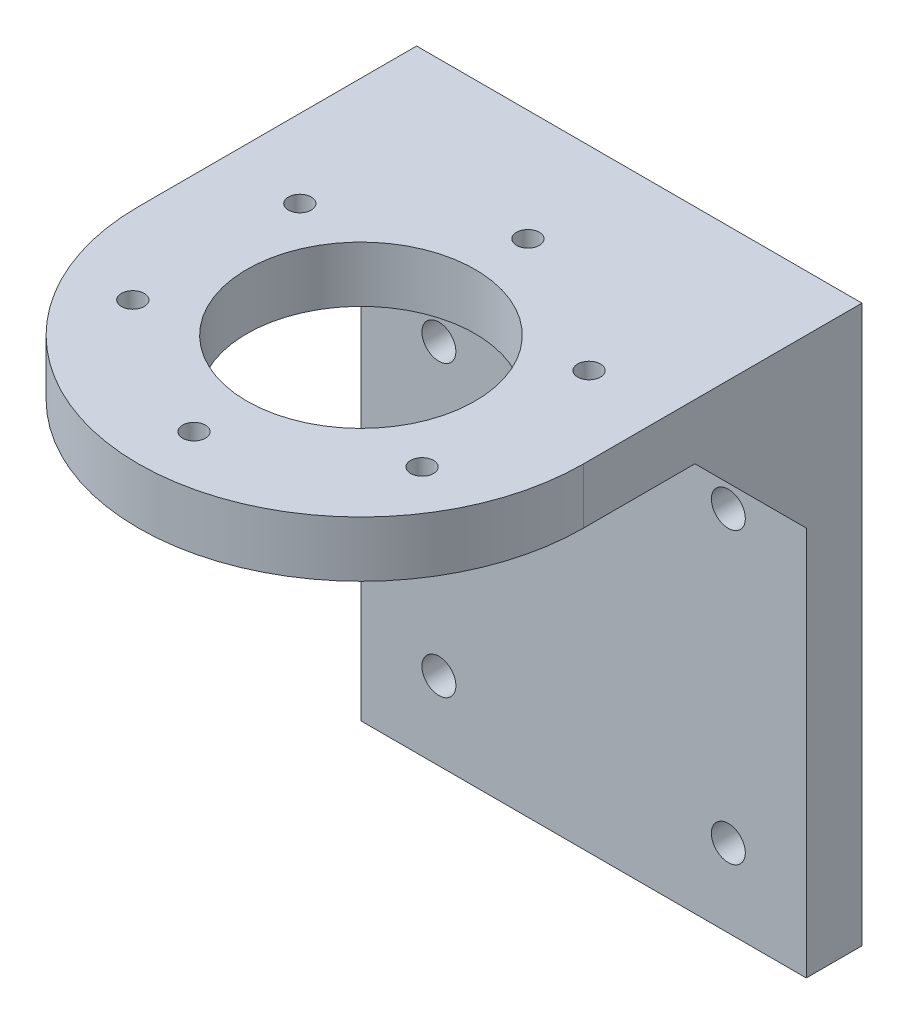
ISO-10303-21;
HEADER;
FILE_DESCRIPTION(('STEP AP214'),'2;1');
FILE_NAME('part.step','',(''),(''),'','','');
FILE_SCHEMA(('AUTOMOTIVE_DESIGN { 1 0 10303 214 1 1 1 1 }'));
ENDSEC;
DATA;
#1=APPLICATION_CONTEXT('core data for automotive mechanical design processes');
#2=APPLICATION_PROTOCOL_DEFINITION('international standard','automotive_design',2000,#1);
#3=PRODUCT_CONTEXT('',#1,'mechanical');
#4=PRODUCT('Part','Part','',(#3));
#5=PRODUCT_RELATED_PRODUCT_CATEGORY('part','',(#4));
#6=PRODUCT_DEFINITION_FORMATION('','',#4);
#7=PRODUCT_DEFINITION_CONTEXT('part definition',#1,'design');
#8=PRODUCT_DEFINITION('design','',#6,#7);
#9=PRODUCT_DEFINITION_SHAPE('','',#8);
#10=(LENGTH_UNIT() NAMED_UNIT(*) SI_UNIT(.MILLI.,.METRE.));
#11=(NAMED_UNIT(*) PLANE_ANGLE_UNIT() SI_UNIT($,.RADIAN.));
#12=(NAMED_UNIT(*) SI_UNIT($,.STERADIAN.) SOLID_ANGLE_UNIT());
#13=UNCERTAINTY_MEASURE_WITH_UNIT(LENGTH_MEASURE(1.E-05),#10,'distance_accuracy_value','');
#14=(GEOMETRIC_REPRESENTATION_CONTEXT(3) GLOBAL_UNCERTAINTY_ASSIGNED_CONTEXT((#13)) GLOBAL_UNIT_ASSIGNED_CONTEXT((#10,
#11,#12)) REPRESENTATION_CONTEXT('',''));
#15=CARTESIAN_POINT('',(0.,0.,0.));
#16=DIRECTION('',(0.,0.,1.));
#17=DIRECTION('',(1.,0.,0.));
#18=AXIS2_PLACEMENT_3D('',#15,#16,#17);
#19=CARTESIAN_POINT('',(20.,5.,-20.));
#20=DIRECTION('',(0.,-1.,0.));
#21=DIRECTION('',(0.,0.,-1.));
#22=AXIS2_PLACEMENT_3D('',#19,#20,#21);
#23=CYLINDRICAL_SURFACE('',#22,20.);
#24=CARTESIAN_POINT('',(20.,0.,-20.));
#25=DIRECTION('',(0.,1.,0.));
#26=DIRECTION('',(0.,0.,1.));
#27=AXIS2_PLACEMENT_3D('',#24,#25,#26);
#28=CIRCLE('',#27,20.);
#29=CARTESIAN_POINT('',(40.,0.,-20.));
#30=VERTEX_POINT('',#29);
#31=CARTESIAN_POINT('',(0.,0.,-20.));
#32=VERTEX_POINT('',#31);
#33=EDGE_CURVE('E231',#30,#32,#28,.F.);
#34=ORIENTED_EDGE('',*,*,#33,.F.);
#35=DIRECTION('',(0.,-1.,0.));
#36=VECTOR('',#35,1.);
#37=CARTESIAN_POINT('',(40.,5.,-20.));
#38=LINE('',#37,#36);
#39=CARTESIAN_POINT('',(40.,5.,-20.));
#40=VERTEX_POINT('',#39);
#41=EDGE_CURVE('E11',#40,#30,#38,.T.);
#42=ORIENTED_EDGE('',*,*,#41,.F.);
#43=CARTESIAN_POINT('',(20.,5.,-20.));
#44=DIRECTION('',(0.,1.,0.));
#45=DIRECTION('',(0.,0.,1.));
#46=AXIS2_PLACEMENT_3D('',#43,#44,#45);
#47=CIRCLE('',#46,20.);
#48=CARTESIAN_POINT('',(0.,5.,-20.));
#49=VERTEX_POINT('',#48);
#50=EDGE_CURVE('E204',#40,#49,#47,.F.);
#51=ORIENTED_EDGE('',*,*,#50,.T.);
#52=DIRECTION('',(0.,-1.,0.));
#53=VECTOR('',#52,1.);
#54=CARTESIAN_POINT('',(0.,5.,-20.));
#55=LINE('',#54,#53);
#56=EDGE_CURVE('E44',#49,#32,#55,.T.);
#57=ORIENTED_EDGE('',*,*,#56,.T.);
#58=EDGE_LOOP('',(#34,#42,#51,#57));
#59=FACE_BOUND('',#58,.T.);
#60=ADVANCED_FACE('F36',(#59),#23,.T.);
#61=CARTESIAN_POINT('',(40.,5.,0.));
#62=DIRECTION('',(-1.,0.,0.));
#63=DIRECTION('',(0.,0.,1.));
#64=AXIS2_PLACEMENT_3D('',#61,#62,#63);
#65=PLANE('',#64);
#66=DIRECTION('',(0.,0.,-1.));
#67=VECTOR('',#66,1.);
#68=CARTESIAN_POINT('',(40.,0.,0.));
#69=LINE('',#68,#67);
#70=CARTESIAN_POINT('',(40.,0.,-30.));
#71=VERTEX_POINT('',#70);
#72=EDGE_CURVE('E233',#30,#71,#69,.T.);
#73=ORIENTED_EDGE('',*,*,#72,.T.);
#74=DIRECTION('',(0.,-0.707106781186547,-0.707106781186548));
#75=VECTOR('',#74,1.);
#76=CARTESIAN_POINT('',(40.,0.,-30.));
#77=LINE('',#76,#75);
#78=CARTESIAN_POINT('',(40.,-10.,-40.));
#79=VERTEX_POINT('',#78);
#80=EDGE_CURVE('E256',#71,#79,#77,.T.);
#81=ORIENTED_EDGE('',*,*,#80,.T.);
#82=DIRECTION('',(0.,1.,0.));
#83=VECTOR('',#82,1.);
#84=CARTESIAN_POINT('',(40.,-45.,-40.));
#85=LINE('',#84,#83);
#86=CARTESIAN_POINT('',(40.,-45.,-40.));
#87=VERTEX_POINT('',#86);
#88=EDGE_CURVE('E187',#87,#79,#85,.T.);
#89=ORIENTED_EDGE('',*,*,#88,.F.);
#90=DIRECTION('',(0.,0.,-1.));
#91=VECTOR('',#90,1.);
#92=CARTESIAN_POINT('',(40.,-45.,-40.));
#93=LINE('',#92,#91);
#94=CARTESIAN_POINT('',(40.,-45.,-45.));
#95=VERTEX_POINT('',#94);
#96=EDGE_CURVE('E171',#87,#95,#93,.T.);
#97=ORIENTED_EDGE('',*,*,#96,.T.);
#98=DIRECTION('',(0.,1.,0.));
#99=VECTOR('',#98,1.);
#100=CARTESIAN_POINT('',(40.,-45.,-45.));
#101=LINE('',#100,#99);
#102=CARTESIAN_POINT('',(40.,5.,-45.));
#103=VERTEX_POINT('',#102);
#104=EDGE_CURVE('E184',#95,#103,#101,.T.);
#105=ORIENTED_EDGE('',*,*,#104,.T.);
#106=DIRECTION('',(0.,0.,-1.));
#107=VECTOR('',#106,1.);
#108=CARTESIAN_POINT('',(40.,5.,0.));
#109=LINE('',#108,#107);
#110=EDGE_CURVE('E207',#40,#103,#109,.T.);
#111=ORIENTED_EDGE('',*,*,#110,.F.);
#112=ORIENTED_EDGE('',*,*,#41,.T.);
#113=EDGE_LOOP('',(#73,#81,#89,#97,#105,#111,#112));
#114=FACE_BOUND('',#113,.T.);
#115=ADVANCED_FACE('F277',(#114),#65,.F.);
#116=CARTESIAN_POINT('',(32.9903810567666,5.,-12.5));
#117=DIRECTION('',(0.,-1.,0.));
#118=DIRECTION('',(0.,0.,-1.));
#119=AXIS2_PLACEMENT_3D('',#116,#117,#118);
#120=CYLINDRICAL_SURFACE('',#119,1.025);
#121=CARTESIAN_POINT('',(32.9903810567666,5.,-12.5));
#122=DIRECTION('',(0.,1.,0.));
#123=DIRECTION('',(0.,0.,1.));
#124=AXIS2_PLACEMENT_3D('',#121,#122,#123);
#125=CIRCLE('',#124,1.025);
#126=CARTESIAN_POINT('',(32.9903810567666,5.,-11.475));
#127=VERTEX_POINT('',#126);
#128=EDGE_CURVE('E214',#127,#127,#125,.F.);
#129=ORIENTED_EDGE('',*,*,#128,.F.);
#130=EDGE_LOOP('',(#129));
#131=FACE_BOUND('',#130,.T.);
#132=CARTESIAN_POINT('',(32.9903810567666,0.,-12.5));
#133=DIRECTION('',(0.,1.,0.));
#134=DIRECTION('',(0.,0.,1.));
#135=AXIS2_PLACEMENT_3D('',#132,#133,#134);
#136=CIRCLE('',#135,1.025);
#137=CARTESIAN_POINT('',(32.9903810567666,0.,-11.475));
#138=VERTEX_POINT('',#137);
#139=EDGE_CURVE('E241',#138,#138,#136,.F.);
#140=ORIENTED_EDGE('',*,*,#139,.T.);
#141=EDGE_LOOP('',(#140));
#142=FACE_BOUND('',#141,.T.);
#143=ADVANCED_FACE('F318',(#131,#142),#120,.F.);
#144=CARTESIAN_POINT('',(20.,5.,-20.));
#145=DIRECTION('',(0.,-1.,0.));
#146=DIRECTION('',(0.,0.,-1.));
#147=AXIS2_PLACEMENT_3D('',#144,#145,#146);
#148=CYLINDRICAL_SURFACE('',#147,10.25);
#149=CARTESIAN_POINT('',(20.,5.,-20.));
#150=DIRECTION('',(0.,1.,0.));
#151=DIRECTION('',(0.,0.,1.));
#152=AXIS2_PLACEMENT_3D('',#149,#150,#151);
#153=CIRCLE('',#152,10.25);
#154=CARTESIAN_POINT('',(20.,5.,-9.75000000000001));
#155=VERTEX_POINT('',#154);
#156=EDGE_CURVE('E211',#155,#155,#153,.T.);
#157=ORIENTED_EDGE('',*,*,#156,.T.);
#158=EDGE_LOOP('',(#157));
#159=FACE_BOUND('',#158,.T.);
#160=CARTESIAN_POINT('',(20.,0.,-20.));
#161=DIRECTION('',(0.,1.,0.));
#162=DIRECTION('',(0.,0.,1.));
#163=AXIS2_PLACEMENT_3D('',#160,#161,#162);
#164=CIRCLE('',#163,10.25);
#165=CARTESIAN_POINT('',(20.,0.,-9.75000000000001));
#166=VERTEX_POINT('',#165);
#167=EDGE_CURVE('E238',#166,#166,#164,.T.);
#168=ORIENTED_EDGE('',*,*,#167,.F.);
#169=EDGE_LOOP('',(#168));
#170=FACE_BOUND('',#169,.T.);
#171=ADVANCED_FACE('F432',(#159,#170),#148,.F.);
#172=CARTESIAN_POINT('',(0.,5.,0.));
#173=DIRECTION('',(-1.,0.,0.));
#174=DIRECTION('',(0.,0.,1.));
#175=AXIS2_PLACEMENT_3D('',#172,#173,#174);
#176=PLANE('',#175);
#177=DIRECTION('',(0.,0.,-1.));
#178=VECTOR('',#177,1.);
#179=CARTESIAN_POINT('',(0.,0.,0.));
#180=LINE('',#179,#178);
#181=CARTESIAN_POINT('',(0.,0.,-30.));
#182=VERTEX_POINT('',#181);
#183=EDGE_CURVE('E134',#32,#182,#180,.T.);
#184=ORIENTED_EDGE('',*,*,#183,.F.);
#185=ORIENTED_EDGE('',*,*,#56,.F.);
#186=DIRECTION('',(0.,0.,-1.));
#187=VECTOR('',#186,1.);
#188=CARTESIAN_POINT('',(0.,5.,0.));
#189=LINE('',#188,#187);
#190=CARTESIAN_POINT('',(0.,5.,-45.));
#191=VERTEX_POINT('',#190);
#192=EDGE_CURVE('E209',#49,#191,#189,.T.);
#193=ORIENTED_EDGE('',*,*,#192,.T.);
#194=DIRECTION('',(0.,1.,0.));
#195=VECTOR('',#194,1.);
#196=CARTESIAN_POINT('',(0.,-45.,-45.));
#197=LINE('',#196,#195);
#198=CARTESIAN_POINT('',(0.,-45.,-45.));
#199=VERTEX_POINT('',#198);
#200=EDGE_CURVE('E180',#199,#191,#197,.T.);
#201=ORIENTED_EDGE('',*,*,#200,.F.);
#202=DIRECTION('',(0.,0.,1.));
#203=VECTOR('',#202,1.);
#204=CARTESIAN_POINT('',(0.,-45.,-40.));
#205=LINE('',#204,#203);
#206=CARTESIAN_POINT('',(0.,-45.,-40.));
#207=VERTEX_POINT('',#206);
#208=EDGE_CURVE('E165',#199,#207,#205,.T.);
#209=ORIENTED_EDGE('',*,*,#208,.T.);
#210=DIRECTION('',(0.,1.,0.));
#211=VECTOR('',#210,1.);
#212=CARTESIAN_POINT('',(0.,-45.,-40.));
#213=LINE('',#212,#211);
#214=CARTESIAN_POINT('',(0.,-10.,-40.));
#215=VERTEX_POINT('',#214);
#216=EDGE_CURVE('E177',#207,#215,#213,.T.);
#217=ORIENTED_EDGE('',*,*,#216,.T.);
#218=DIRECTION('',(0.,0.707106781186547,0.707106781186548));
#219=VECTOR('',#218,1.);
#220=CARTESIAN_POINT('',(0.,-10.,-40.));
#221=LINE('',#220,#219);
#222=EDGE_CURVE('E127',#215,#182,#221,.T.);
#223=ORIENTED_EDGE('',*,*,#222,.T.);
#224=EDGE_LOOP('',(#184,#185,#193,#201,#209,#217,#223));
#225=FACE_BOUND('',#224,.T.);
#226=ADVANCED_FACE('F250',(#225),#176,.T.);
#227=CARTESIAN_POINT('',(20.,5.,-5.00000000000001));
#228=DIRECTION('',(0.,-1.,0.));
#229=DIRECTION('',(0.,0.,-1.));
#230=AXIS2_PLACEMENT_3D('',#227,#228,#229);
#231=CYLINDRICAL_SURFACE('',#230,1.025);
#232=CARTESIAN_POINT('',(20.,5.,-5.00000000000001));
#233=DIRECTION('',(0.,1.,0.));
#234=DIRECTION('',(0.,0.,1.));
#235=AXIS2_PLACEMENT_3D('',#232,#233,#234);
#236=CIRCLE('',#235,1.025);
#237=CARTESIAN_POINT('',(20.,5.,-3.97500000000001));
#238=VERTEX_POINT('',#237);
#239=EDGE_CURVE('E201',#238,#238,#236,.T.);
#240=ORIENTED_EDGE('',*,*,#239,.T.);
#241=EDGE_LOOP('',(#240));
#242=FACE_BOUND('',#241,.T.);
#243=CARTESIAN_POINT('',(20.,0.,-5.00000000000001));
#244=DIRECTION('',(0.,1.,0.));
#245=DIRECTION('',(0.,0.,1.));
#246=AXIS2_PLACEMENT_3D('',#243,#244,#245);
#247=CIRCLE('',#246,1.025);
#248=CARTESIAN_POINT('',(20.,0.,-3.97500000000001));
#249=VERTEX_POINT('',#248);
#250=EDGE_CURVE('E228',#249,#249,#247,.T.);
#251=ORIENTED_EDGE('',*,*,#250,.F.);
#252=EDGE_LOOP('',(#251));
#253=FACE_BOUND('',#252,.T.);
#254=ADVANCED_FACE('F322',(#242,#253),#231,.F.);
#255=CARTESIAN_POINT('',(32.9903810567666,5.,-27.5));
#256=DIRECTION('',(0.,-1.,0.));
#257=DIRECTION('',(0.,0.,-1.));
#258=AXIS2_PLACEMENT_3D('',#255,#256,#257);
#259=CYLINDRICAL_SURFACE('',#258,1.025);
#260=CARTESIAN_POINT('',(32.9903810567666,5.,-27.5));
#261=DIRECTION('',(0.,1.,0.));
#262=DIRECTION('',(0.,0.,1.));
#263=AXIS2_PLACEMENT_3D('',#260,#261,#262);
#264=CIRCLE('',#263,1.025);
#265=CARTESIAN_POINT('',(32.9903810567666,5.,-26.475));
#266=VERTEX_POINT('',#265);
#267=EDGE_CURVE('E198',#266,#266,#264,.T.);
#268=ORIENTED_EDGE('',*,*,#267,.T.);
#269=EDGE_LOOP('',(#268));
#270=FACE_BOUND('',#269,.T.);
#271=CARTESIAN_POINT('',(32.9903810567666,0.,-27.5));
#272=DIRECTION('',(0.,1.,0.));
#273=DIRECTION('',(0.,0.,1.));
#274=AXIS2_PLACEMENT_3D('',#271,#272,#273);
#275=CIRCLE('',#274,1.025);
#276=CARTESIAN_POINT('',(32.9903810567666,0.,-26.475));
#277=VERTEX_POINT('',#276);
#278=EDGE_CURVE('E225',#277,#277,#275,.T.);
#279=ORIENTED_EDGE('',*,*,#278,.F.);
#280=EDGE_LOOP('',(#279));
#281=FACE_BOUND('',#280,.T.);
#282=ADVANCED_FACE('F325',(#270,#281),#259,.F.);
#283=CARTESIAN_POINT('',(7.00961894323342,5.,-27.5));
#284=DIRECTION('',(0.,-1.,0.));
#285=DIRECTION('',(0.,0.,-1.));
#286=AXIS2_PLACEMENT_3D('',#283,#284,#285);
#287=CYLINDRICAL_SURFACE('',#286,1.02499999999999);
#288=CARTESIAN_POINT('',(7.00961894323342,5.,-27.5));
#289=DIRECTION('',(0.,1.,0.));
#290=DIRECTION('',(0.,0.,1.));
#291=AXIS2_PLACEMENT_3D('',#288,#289,#290);
#292=CIRCLE('',#291,1.02499999999999);
#293=CARTESIAN_POINT('',(7.00961894323342,5.,-26.475));
#294=VERTEX_POINT('',#293);
#295=EDGE_CURVE('E194',#294,#294,#292,.T.);
#296=ORIENTED_EDGE('',*,*,#295,.T.);
#297=EDGE_LOOP('',(#296));
#298=FACE_BOUND('',#297,.T.);
#299=CARTESIAN_POINT('',(7.00961894323342,0.,-27.5));
#300=DIRECTION('',(0.,1.,0.));
#301=DIRECTION('',(0.,0.,1.));
#302=AXIS2_PLACEMENT_3D('',#299,#300,#301);
#303=CIRCLE('',#302,1.02499999999999);
#304=CARTESIAN_POINT('',(7.00961894323342,0.,-26.475));
#305=VERTEX_POINT('',#304);
#306=EDGE_CURVE('E222',#305,#305,#303,.T.);
#307=ORIENTED_EDGE('',*,*,#306,.F.);
#308=EDGE_LOOP('',(#307));
#309=FACE_BOUND('',#308,.T.);
#310=ADVANCED_FACE('F328',(#298,#309),#287,.F.);
#311=CARTESIAN_POINT('',(7.00961894323342,5.,-12.5));
#312=DIRECTION('',(0.,-1.,0.));
#313=DIRECTION('',(0.,0.,-1.));
#314=AXIS2_PLACEMENT_3D('',#311,#312,#313);
#315=CYLINDRICAL_SURFACE('',#314,1.02499999999999);
#316=CARTESIAN_POINT('',(7.00961894323342,5.,-12.5));
#317=DIRECTION('',(0.,1.,0.));
#318=DIRECTION('',(0.,0.,1.));
#319=AXIS2_PLACEMENT_3D('',#316,#317,#318);
#320=CIRCLE('',#319,1.02499999999999);
#321=CARTESIAN_POINT('',(7.00961894323342,5.,-11.475));
#322=VERTEX_POINT('',#321);
#323=EDGE_CURVE('E191',#322,#322,#320,.F.);
#324=ORIENTED_EDGE('',*,*,#323,.F.);
#325=EDGE_LOOP('',(#324));
#326=FACE_BOUND('',#325,.T.);
#327=CARTESIAN_POINT('',(7.00961894323342,0.,-12.5));
#328=DIRECTION('',(0.,1.,0.));
#329=DIRECTION('',(0.,0.,1.));
#330=AXIS2_PLACEMENT_3D('',#327,#328,#329);
#331=CIRCLE('',#330,1.02499999999999);
#332=CARTESIAN_POINT('',(7.00961894323342,0.,-11.475));
#333=VERTEX_POINT('',#332);
#334=EDGE_CURVE('E183',#333,#333,#331,.F.);
#335=ORIENTED_EDGE('',*,*,#334,.T.);
#336=EDGE_LOOP('',(#335));
#337=FACE_BOUND('',#336,.T.);
#338=ADVANCED_FACE('F38',(#326,#337),#315,.F.);
#339=CARTESIAN_POINT('',(20.,5.,-35.));
#340=DIRECTION('',(0.,-1.,0.));
#341=DIRECTION('',(0.,0.,-1.));
#342=AXIS2_PLACEMENT_3D('',#339,#340,#341);
#343=CYLINDRICAL_SURFACE('',#342,1.025);
#344=CARTESIAN_POINT('',(20.,5.,-35.));
#345=DIRECTION('',(0.,1.,0.));
#346=DIRECTION('',(0.,0.,1.));
#347=AXIS2_PLACEMENT_3D('',#344,#345,#346);
#348=CIRCLE('',#347,1.025);
#349=CARTESIAN_POINT('',(20.,5.,-33.975));
#350=VERTEX_POINT('',#349);
#351=EDGE_CURVE('E217',#350,#350,#348,.F.);
#352=ORIENTED_EDGE('',*,*,#351,.F.);
#353=EDGE_LOOP('',(#352));
#354=FACE_BOUND('',#353,.T.);
#355=CARTESIAN_POINT('',(20.,0.,-35.));
#356=DIRECTION('',(0.,1.,0.));
#357=DIRECTION('',(0.,0.,1.));
#358=AXIS2_PLACEMENT_3D('',#355,#356,#357);
#359=CIRCLE('',#358,1.025);
#360=CARTESIAN_POINT('',(20.,0.,-33.975));
#361=VERTEX_POINT('',#360);
#362=EDGE_CURVE('E195',#361,#361,#359,.F.);
#363=ORIENTED_EDGE('',*,*,#362,.T.);
#364=EDGE_LOOP('',(#363));
#365=FACE_BOUND('',#364,.T.);
#366=ADVANCED_FACE('F290',(#354,#365),#343,.F.);
#367=CARTESIAN_POINT('',(0.,5.,0.));
#368=DIRECTION('',(0.,1.,0.));
#369=DIRECTION('',(0.,0.,1.));
#370=AXIS2_PLACEMENT_3D('',#367,#368,#369);
#371=PLANE('',#370);
#372=ORIENTED_EDGE('',*,*,#323,.T.);
#373=EDGE_LOOP('',(#372));
#374=FACE_BOUND('',#373,.T.);
#375=ORIENTED_EDGE('',*,*,#295,.F.);
#376=EDGE_LOOP('',(#375));
#377=FACE_BOUND('',#376,.T.);
#378=ORIENTED_EDGE('',*,*,#267,.F.);
#379=EDGE_LOOP('',(#378));
#380=FACE_BOUND('',#379,.T.);
#381=ORIENTED_EDGE('',*,*,#239,.F.);
#382=EDGE_LOOP('',(#381));
#383=FACE_BOUND('',#382,.T.);
#384=ORIENTED_EDGE('',*,*,#50,.F.);
#385=ORIENTED_EDGE('',*,*,#110,.T.);
#386=DIRECTION('',(-1.,0.,0.));
#387=VECTOR('',#386,1.);
#388=CARTESIAN_POINT('',(0.,5.,-45.));
#389=LINE('',#388,#387);
#390=EDGE_CURVE('E162',#103,#191,#389,.T.);
#391=ORIENTED_EDGE('',*,*,#390,.T.);
#392=ORIENTED_EDGE('',*,*,#192,.F.);
#393=EDGE_LOOP('',(#384,#385,#391,#392));
#394=FACE_BOUND('',#393,.T.);
#395=ORIENTED_EDGE('',*,*,#156,.F.);
#396=EDGE_LOOP('',(#395));
#397=FACE_BOUND('',#396,.T.);
#398=ORIENTED_EDGE('',*,*,#128,.T.);
#399=EDGE_LOOP('',(#398));
#400=FACE_BOUND('',#399,.T.);
#401=ORIENTED_EDGE('',*,*,#351,.T.);
#402=EDGE_LOOP('',(#401));
#403=FACE_BOUND('',#402,.T.);
#404=ADVANCED_FACE('F287',(#374,#377,#380,#383,#394,#397,#400,#403),#371,.T.);
#405=CARTESIAN_POINT('',(0.,0.,0.));
#406=DIRECTION('',(0.,1.,0.));
#407=DIRECTION('',(0.,0.,1.));
#408=AXIS2_PLACEMENT_3D('',#405,#406,#407);
#409=PLANE('',#408);
#410=ORIENTED_EDGE('',*,*,#334,.F.);
#411=EDGE_LOOP('',(#410));
#412=FACE_BOUND('',#411,.T.);
#413=ORIENTED_EDGE('',*,*,#306,.T.);
#414=EDGE_LOOP('',(#413));
#415=FACE_BOUND('',#414,.T.);
#416=ORIENTED_EDGE('',*,*,#278,.T.);
#417=EDGE_LOOP('',(#416));
#418=FACE_BOUND('',#417,.T.);
#419=ORIENTED_EDGE('',*,*,#250,.T.);
#420=EDGE_LOOP('',(#419));
#421=FACE_BOUND('',#420,.T.);
#422=DIRECTION('',(0.,0.,1.));
#423=VECTOR('',#422,1.);
#424=CARTESIAN_POINT('',(37.,0.,-40.));
#425=LINE('',#424,#423);
#426=CARTESIAN_POINT('',(37.,0.,-40.));
#427=VERTEX_POINT('',#426);
#428=CARTESIAN_POINT('',(37.,0.,-30.));
#429=VERTEX_POINT('',#428);
#430=EDGE_CURVE('E51',#427,#429,#425,.T.);
#431=ORIENTED_EDGE('',*,*,#430,.T.);
#432=DIRECTION('',(1.,0.,0.));
#433=VECTOR('',#432,1.);
#434=CARTESIAN_POINT('',(37.,0.,-30.));
#435=LINE('',#434,#433);
#436=EDGE_CURVE('E55',#429,#71,#435,.T.);
#437=ORIENTED_EDGE('',*,*,#436,.T.);
#438=ORIENTED_EDGE('',*,*,#72,.F.);
#439=ORIENTED_EDGE('',*,*,#33,.T.);
#440=ORIENTED_EDGE('',*,*,#183,.T.);
#441=DIRECTION('',(-1.,0.,0.));
#442=VECTOR('',#441,1.);
#443=CARTESIAN_POINT('',(3.,0.,-30.));
#444=LINE('',#443,#442);
#445=CARTESIAN_POINT('',(3.,0.,-30.));
#446=VERTEX_POINT('',#445);
#447=EDGE_CURVE('E123',#446,#182,#444,.T.);
#448=ORIENTED_EDGE('',*,*,#447,.F.);
#449=DIRECTION('',(0.,0.,-1.));
#450=VECTOR('',#449,1.);
#451=CARTESIAN_POINT('',(3.,0.,-30.));
#452=LINE('',#451,#450);
#453=CARTESIAN_POINT('',(3.,0.,-40.));
#454=VERTEX_POINT('',#453);
#455=EDGE_CURVE('E112',#446,#454,#452,.T.);
#456=ORIENTED_EDGE('',*,*,#455,.T.);
#457=DIRECTION('',(1.,0.,0.));
#458=VECTOR('',#457,1.);
#459=CARTESIAN_POINT('',(0.,0.,-40.));
#460=LINE('',#459,#458);
#461=EDGE_CURVE('E235',#454,#427,#460,.T.);
#462=ORIENTED_EDGE('',*,*,#461,.T.);
#463=EDGE_LOOP('',(#431,#437,#438,#439,#440,#448,#456,#462));
#464=FACE_BOUND('',#463,.T.);
#465=ORIENTED_EDGE('',*,*,#167,.T.);
#466=EDGE_LOOP('',(#465));
#467=FACE_BOUND('',#466,.T.);
#468=ORIENTED_EDGE('',*,*,#139,.F.);
#469=EDGE_LOOP('',(#468));
#470=FACE_BOUND('',#469,.T.);
#471=ORIENTED_EDGE('',*,*,#362,.F.);
#472=EDGE_LOOP('',(#471));
#473=FACE_BOUND('',#472,.T.);
#474=ADVANCED_FACE('F130',(#412,#415,#418,#421,#464,#467,#470,#473),#409,.F.);
#475=CARTESIAN_POINT('',(0.,-45.,-40.));
#476=DIRECTION('',(0.,0.,1.));
#477=DIRECTION('',(1.,0.,0.));
#478=AXIS2_PLACEMENT_3D('',#475,#476,#477);
#479=PLANE('',#478);
#480=DIRECTION('',(1.,0.,0.));
#481=VECTOR('',#480,1.);
#482=CARTESIAN_POINT('',(37.,-10.,-40.));
#483=LINE('',#482,#481);
#484=CARTESIAN_POINT('',(37.,-10.,-40.));
#485=VERTEX_POINT('',#484);
#486=EDGE_CURVE('E251',#485,#79,#483,.T.);
#487=ORIENTED_EDGE('',*,*,#486,.F.);
#488=DIRECTION('',(0.,1.,0.));
#489=VECTOR('',#488,1.);
#490=CARTESIAN_POINT('',(37.,-10.,-40.));
#491=LINE('',#490,#489);
#492=EDGE_CURVE('E261',#485,#427,#491,.T.);
#493=ORIENTED_EDGE('',*,*,#492,.T.);
#494=ORIENTED_EDGE('',*,*,#461,.F.);
#495=DIRECTION('',(0.,-1.,0.));
#496=VECTOR('',#495,1.);
#497=CARTESIAN_POINT('',(3.,0.,-40.));
#498=LINE('',#497,#496);
#499=CARTESIAN_POINT('',(3.,-10.,-40.));
#500=VERTEX_POINT('',#499);
#501=EDGE_CURVE('E117',#454,#500,#498,.T.);
#502=ORIENTED_EDGE('',*,*,#501,.T.);
#503=DIRECTION('',(-1.,0.,0.));
#504=VECTOR('',#503,1.);
#505=CARTESIAN_POINT('',(3.,-10.,-40.));
#506=LINE('',#505,#504);
#507=EDGE_CURVE('E126',#500,#215,#506,.T.);
#508=ORIENTED_EDGE('',*,*,#507,.T.);
#509=ORIENTED_EDGE('',*,*,#216,.F.);
#510=DIRECTION('',(1.,0.,0.));
#511=VECTOR('',#510,1.);
#512=CARTESIAN_POINT('',(0.,-45.,-40.));
#513=LINE('',#512,#511);
#514=EDGE_CURVE('E168',#207,#87,#513,.T.);
#515=ORIENTED_EDGE('',*,*,#514,.T.);
#516=ORIENTED_EDGE('',*,*,#88,.T.);
#517=EDGE_LOOP('',(#487,#493,#494,#502,#508,#509,#515,#516));
#518=FACE_BOUND('',#517,.T.);
#519=CARTESIAN_POINT('',(33.,-12.,-40.));
#520=DIRECTION('',(0.,0.,1.));
#521=DIRECTION('',(1.,0.,0.));
#522=AXIS2_PLACEMENT_3D('',#519,#520,#521);
#523=CIRCLE('',#522,1.525);
#524=CARTESIAN_POINT('',(34.525,-12.,-40.));
#525=VERTEX_POINT('',#524);
#526=EDGE_CURVE('E136',#525,#525,#523,.F.);
#527=ORIENTED_EDGE('',*,*,#526,.T.);
#528=EDGE_LOOP('',(#527));
#529=FACE_BOUND('',#528,.T.);
#530=CARTESIAN_POINT('',(33.,-38.,-40.));
#531=DIRECTION('',(0.,0.,1.));
#532=DIRECTION('',(1.,0.,0.));
#533=AXIS2_PLACEMENT_3D('',#530,#531,#532);
#534=CIRCLE('',#533,1.525);
#535=CARTESIAN_POINT('',(34.525,-38.,-40.));
#536=VERTEX_POINT('',#535);
#537=EDGE_CURVE('E151',#536,#536,#534,.F.);
#538=ORIENTED_EDGE('',*,*,#537,.T.);
#539=EDGE_LOOP('',(#538));
#540=FACE_BOUND('',#539,.T.);
#541=CARTESIAN_POINT('',(6.99999999999998,-38.,-40.));
#542=DIRECTION('',(0.,0.,1.));
#543=DIRECTION('',(1.,0.,0.));
#544=AXIS2_PLACEMENT_3D('',#541,#542,#543);
#545=CIRCLE('',#544,1.525);
#546=CARTESIAN_POINT('',(8.52499999999997,-38.,-40.));
#547=VERTEX_POINT('',#546);
#548=EDGE_CURVE('E145',#547,#547,#545,.F.);
#549=ORIENTED_EDGE('',*,*,#548,.T.);
#550=EDGE_LOOP('',(#549));
#551=FACE_BOUND('',#550,.T.);
#552=CARTESIAN_POINT('',(6.99999999999999,-12.,-40.));
#553=DIRECTION('',(0.,0.,1.));
#554=DIRECTION('',(1.,0.,0.));
#555=AXIS2_PLACEMENT_3D('',#552,#553,#554);
#556=CIRCLE('',#555,1.525);
#557=CARTESIAN_POINT('',(8.52499999999999,-12.,-40.));
#558=VERTEX_POINT('',#557);
#559=EDGE_CURVE('E144',#558,#558,#556,.F.);
#560=ORIENTED_EDGE('',*,*,#559,.T.);
#561=EDGE_LOOP('',(#560));
#562=FACE_BOUND('',#561,.T.);
#563=ADVANCED_FACE('F272',(#518,#529,#540,#551,#562),#479,.T.);
#564=CARTESIAN_POINT('',(0.,-45.,-45.));
#565=DIRECTION('',(0.,0.,-1.));
#566=DIRECTION('',(-1.,0.,0.));
#567=AXIS2_PLACEMENT_3D('',#564,#565,#566);
#568=PLANE('',#567);
#569=CARTESIAN_POINT('',(33.,-12.,-45.));
#570=DIRECTION('',(0.,0.,-1.));
#571=DIRECTION('',(-1.,0.,0.));
#572=AXIS2_PLACEMENT_3D('',#569,#570,#571);
#573=CIRCLE('',#572,1.525);
#574=CARTESIAN_POINT('',(31.475,-12.,-45.));
#575=VERTEX_POINT('',#574);
#576=EDGE_CURVE('E154',#575,#575,#573,.T.);
#577=ORIENTED_EDGE('',*,*,#576,.F.);
#578=EDGE_LOOP('',(#577));
#579=FACE_BOUND('',#578,.T.);
#580=CARTESIAN_POINT('',(33.,-38.,-45.));
#581=DIRECTION('',(0.,0.,-1.));
#582=DIRECTION('',(-1.,0.,0.));
#583=AXIS2_PLACEMENT_3D('',#580,#581,#582);
#584=CIRCLE('',#583,1.525);
#585=CARTESIAN_POINT('',(31.475,-38.,-45.));
#586=VERTEX_POINT('',#585);
#587=EDGE_CURVE('E148',#586,#586,#584,.T.);
#588=ORIENTED_EDGE('',*,*,#587,.F.);
#589=EDGE_LOOP('',(#588));
#590=FACE_BOUND('',#589,.T.);
#591=CARTESIAN_POINT('',(6.99999999999998,-38.,-45.));
#592=DIRECTION('',(0.,0.,-1.));
#593=DIRECTION('',(-1.,0.,0.));
#594=AXIS2_PLACEMENT_3D('',#591,#592,#593);
#595=CIRCLE('',#594,1.525);
#596=CARTESIAN_POINT('',(5.47499999999998,-38.,-45.));
#597=VERTEX_POINT('',#596);
#598=EDGE_CURVE('E141',#597,#597,#595,.T.);
#599=ORIENTED_EDGE('',*,*,#598,.F.);
#600=EDGE_LOOP('',(#599));
#601=FACE_BOUND('',#600,.T.);
#602=CARTESIAN_POINT('',(6.99999999999999,-12.,-45.));
#603=DIRECTION('',(0.,0.,-1.));
#604=DIRECTION('',(-1.,0.,0.));
#605=AXIS2_PLACEMENT_3D('',#602,#603,#604);
#606=CIRCLE('',#605,1.525);
#607=CARTESIAN_POINT('',(5.47499999999998,-12.,-45.));
#608=VERTEX_POINT('',#607);
#609=EDGE_CURVE('E159',#608,#608,#606,.T.);
#610=ORIENTED_EDGE('',*,*,#609,.F.);
#611=EDGE_LOOP('',(#610));
#612=FACE_BOUND('',#611,.T.);
#613=ORIENTED_EDGE('',*,*,#390,.F.);
#614=ORIENTED_EDGE('',*,*,#104,.F.);
#615=DIRECTION('',(-1.,0.,0.));
#616=VECTOR('',#615,1.);
#617=CARTESIAN_POINT('',(0.,-45.,-45.));
#618=LINE('',#617,#616);
#619=EDGE_CURVE('E174',#95,#199,#618,.T.);
#620=ORIENTED_EDGE('',*,*,#619,.T.);
#621=ORIENTED_EDGE('',*,*,#200,.T.);
#622=EDGE_LOOP('',(#613,#614,#620,#621));
#623=FACE_BOUND('',#622,.T.);
#624=ADVANCED_FACE('F284',(#579,#590,#601,#612,#623),#568,.T.);
#625=CARTESIAN_POINT('',(0.,-45.,0.));
#626=DIRECTION('',(0.,-1.,0.));
#627=DIRECTION('',(0.,0.,-1.));
#628=AXIS2_PLACEMENT_3D('',#625,#626,#627);
#629=PLANE('',#628);
#630=ORIENTED_EDGE('',*,*,#208,.F.);
#631=ORIENTED_EDGE('',*,*,#619,.F.);
#632=ORIENTED_EDGE('',*,*,#96,.F.);
#633=ORIENTED_EDGE('',*,*,#514,.F.);
#634=EDGE_LOOP('',(#630,#631,#632,#633));
#635=FACE_BOUND('',#634,.T.);
#636=ADVANCED_FACE('F281',(#635),#629,.T.);
#637=CARTESIAN_POINT('',(6.99999999999999,-12.,0.001000000000001));
#638=DIRECTION('',(0.,0.,-1.));
#639=DIRECTION('',(-1.,0.,0.));
#640=AXIS2_PLACEMENT_3D('',#637,#638,#639);
#641=CYLINDRICAL_SURFACE('',#640,1.525);
#642=ORIENTED_EDGE('',*,*,#559,.F.);
#643=EDGE_LOOP('',(#642));
#644=FACE_BOUND('',#643,.T.);
#645=ORIENTED_EDGE('',*,*,#609,.T.);
#646=EDGE_LOOP('',(#645));
#647=FACE_BOUND('',#646,.T.);
#648=ADVANCED_FACE('F374',(#644,#647),#641,.F.);
#649=CARTESIAN_POINT('',(6.99999999999998,-38.,0.001000000000001));
#650=DIRECTION('',(0.,0.,-1.));
#651=DIRECTION('',(-1.,0.,0.));
#652=AXIS2_PLACEMENT_3D('',#649,#650,#651);
#653=CYLINDRICAL_SURFACE('',#652,1.525);
#654=ORIENTED_EDGE('',*,*,#548,.F.);
#655=EDGE_LOOP('',(#654));
#656=FACE_BOUND('',#655,.T.);
#657=ORIENTED_EDGE('',*,*,#598,.T.);
#658=EDGE_LOOP('',(#657));
#659=FACE_BOUND('',#658,.T.);
#660=ADVANCED_FACE('F392',(#656,#659),#653,.F.);
#661=CARTESIAN_POINT('',(33.,-38.,0.001000000000001));
#662=DIRECTION('',(0.,0.,-1.));
#663=DIRECTION('',(-1.,0.,0.));
#664=AXIS2_PLACEMENT_3D('',#661,#662,#663);
#665=CYLINDRICAL_SURFACE('',#664,1.525);
#666=ORIENTED_EDGE('',*,*,#537,.F.);
#667=EDGE_LOOP('',(#666));
#668=FACE_BOUND('',#667,.T.);
#669=ORIENTED_EDGE('',*,*,#587,.T.);
#670=EDGE_LOOP('',(#669));
#671=FACE_BOUND('',#670,.T.);
#672=ADVANCED_FACE('F402',(#668,#671),#665,.F.);
#673=CARTESIAN_POINT('',(33.,-12.,0.001000000000001));
#674=DIRECTION('',(0.,0.,-1.));
#675=DIRECTION('',(-1.,0.,0.));
#676=AXIS2_PLACEMENT_3D('',#673,#674,#675);
#677=CYLINDRICAL_SURFACE('',#676,1.525);
#678=ORIENTED_EDGE('',*,*,#526,.F.);
#679=EDGE_LOOP('',(#678));
#680=FACE_BOUND('',#679,.T.);
#681=ORIENTED_EDGE('',*,*,#576,.T.);
#682=EDGE_LOOP('',(#681));
#683=FACE_BOUND('',#682,.T.);
#684=ADVANCED_FACE('F412',(#680,#683),#677,.F.);
#685=CARTESIAN_POINT('',(3.,-10.,-40.));
#686=DIRECTION('',(0.,-0.707106781186548,0.707106781186547));
#687=DIRECTION('',(0.,-0.707106781186547,-0.707106781186548));
#688=AXIS2_PLACEMENT_3D('',#685,#686,#687);
#689=PLANE('',#688);
#690=ORIENTED_EDGE('',*,*,#222,.F.);
#691=ORIENTED_EDGE('',*,*,#507,.F.);
#692=DIRECTION('',(0.,0.707106781186547,0.707106781186548));
#693=VECTOR('',#692,1.);
#694=CARTESIAN_POINT('',(3.,-10.,-40.));
#695=LINE('',#694,#693);
#696=EDGE_CURVE('E115',#500,#446,#695,.T.);
#697=ORIENTED_EDGE('',*,*,#696,.T.);
#698=ORIENTED_EDGE('',*,*,#447,.T.);
#699=EDGE_LOOP('',(#690,#691,#697,#698));
#700=FACE_BOUND('',#699,.T.);
#701=ADVANCED_FACE('F122',(#700),#689,.T.);
#702=CARTESIAN_POINT('',(3.,0.,0.));
#703=DIRECTION('',(-1.,0.,0.));
#704=DIRECTION('',(0.,0.,1.));
#705=AXIS2_PLACEMENT_3D('',#702,#703,#704);
#706=PLANE('',#705);
#707=ORIENTED_EDGE('',*,*,#696,.F.);
#708=ORIENTED_EDGE('',*,*,#501,.F.);
#709=ORIENTED_EDGE('',*,*,#455,.F.);
#710=EDGE_LOOP('',(#707,#708,#709));
#711=FACE_BOUND('',#710,.T.);
#712=ADVANCED_FACE('F114',(#711),#706,.F.);
#713=CARTESIAN_POINT('',(37.,0.,-30.));
#714=DIRECTION('',(0.,-0.707106781186548,0.707106781186547));
#715=DIRECTION('',(0.,-0.707106781186547,-0.707106781186548));
#716=AXIS2_PLACEMENT_3D('',#713,#714,#715);
#717=PLANE('',#716);
#718=ORIENTED_EDGE('',*,*,#80,.F.);
#719=ORIENTED_EDGE('',*,*,#436,.F.);
#720=DIRECTION('',(0.,-0.707106781186547,-0.707106781186548));
#721=VECTOR('',#720,1.);
#722=CARTESIAN_POINT('',(37.,0.,-30.));
#723=LINE('',#722,#721);
#724=EDGE_CURVE('E259',#429,#485,#723,.T.);
#725=ORIENTED_EDGE('',*,*,#724,.T.);
#726=ORIENTED_EDGE('',*,*,#486,.T.);
#727=EDGE_LOOP('',(#718,#719,#725,#726));
#728=FACE_BOUND('',#727,.T.);
#729=ADVANCED_FACE('F267',(#728),#717,.T.);
#730=CARTESIAN_POINT('',(37.,0.,0.));
#731=DIRECTION('',(1.,0.,0.));
#732=DIRECTION('',(0.,0.,-1.));
#733=AXIS2_PLACEMENT_3D('',#730,#731,#732);
#734=PLANE('',#733);
#735=ORIENTED_EDGE('',*,*,#724,.F.);
#736=ORIENTED_EDGE('',*,*,#430,.F.);
#737=ORIENTED_EDGE('',*,*,#492,.F.);
#738=EDGE_LOOP('',(#735,#736,#737));
#739=FACE_BOUND('',#738,.T.);
#740=ADVANCED_FACE('F270',(#739),#734,.F.);
#741=CLOSED_SHELL('',(#60,#115,#143,#171,#226,#254,#282,#310,#338,#366,#404,#474,#563,#624,#636,
#648,#660,#672,#684,#701,#712,#729,#740));
#742=MANIFOLD_SOLID_BREP('B2',#741);
#743=ADVANCED_BREP_SHAPE_REPRESENTATION('',(#18,#742),#14);
#744=SHAPE_DEFINITION_REPRESENTATION(#9,#743);
ENDSEC;
END-ISO-10303-21;
